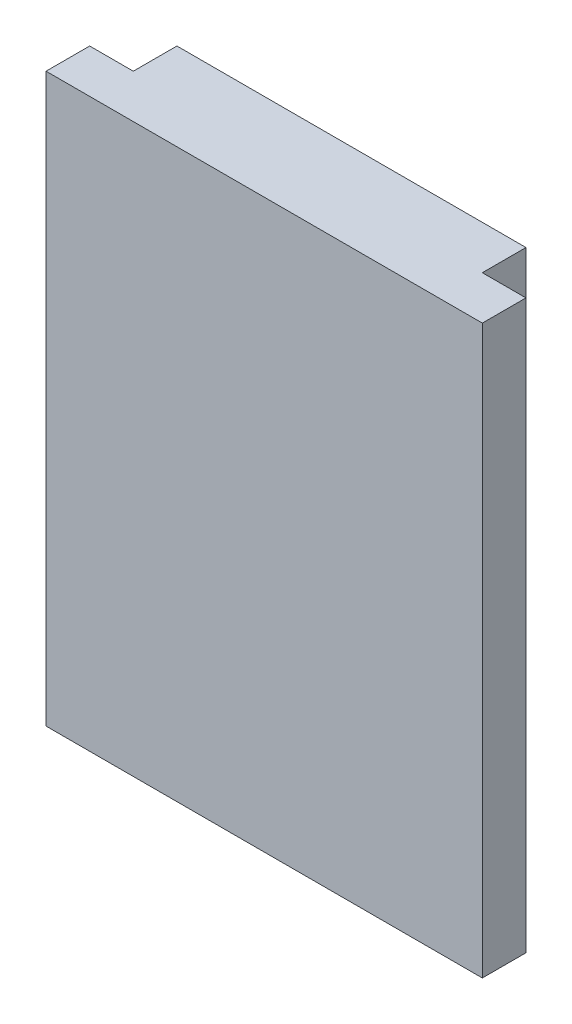
ISO-10303-21;
HEADER;
FILE_DESCRIPTION(('STEP AP214'),'2;1');
FILE_NAME('part.step','',(''),(''),'','','');
FILE_SCHEMA(('AUTOMOTIVE_DESIGN { 1 0 10303 214 1 1 1 1 }'));
ENDSEC;
DATA;
#1=APPLICATION_CONTEXT('core data for automotive mechanical design processes');
#2=APPLICATION_PROTOCOL_DEFINITION('international standard','automotive_design',2000,#1);
#3=PRODUCT_CONTEXT('',#1,'mechanical');
#4=PRODUCT('Part','Part','',(#3));
#5=PRODUCT_RELATED_PRODUCT_CATEGORY('part','',(#4));
#6=PRODUCT_DEFINITION_FORMATION('','',#4);
#7=PRODUCT_DEFINITION_CONTEXT('part definition',#1,'design');
#8=PRODUCT_DEFINITION('design','',#6,#7);
#9=PRODUCT_DEFINITION_SHAPE('','',#8);
#10=(LENGTH_UNIT() NAMED_UNIT(*) SI_UNIT(.MILLI.,.METRE.));
#11=(NAMED_UNIT(*) PLANE_ANGLE_UNIT() SI_UNIT($,.RADIAN.));
#12=(NAMED_UNIT(*) SI_UNIT($,.STERADIAN.) SOLID_ANGLE_UNIT());
#13=UNCERTAINTY_MEASURE_WITH_UNIT(LENGTH_MEASURE(1.E-05),#10,'distance_accuracy_value','');
#14=(GEOMETRIC_REPRESENTATION_CONTEXT(3) GLOBAL_UNCERTAINTY_ASSIGNED_CONTEXT((#13)) GLOBAL_UNIT_ASSIGNED_CONTEXT((#10,
#11,#12)) REPRESENTATION_CONTEXT('',''));
#15=CARTESIAN_POINT('',(0.,0.,0.));
#16=DIRECTION('',(0.,0.,1.));
#17=DIRECTION('',(1.,0.,0.));
#18=AXIS2_PLACEMENT_3D('',#15,#16,#17);
#19=CARTESIAN_POINT('',(0.,0.,5.));
#20=DIRECTION('',(1.,0.,0.));
#21=DIRECTION('',(0.,0.,-1.));
#22=AXIS2_PLACEMENT_3D('',#19,#20,#21);
#23=PLANE('',#22);
#24=DIRECTION('',(0.,-1.,0.));
#25=VECTOR('',#24,1.);
#26=CARTESIAN_POINT('',(0.,0.,0.));
#27=LINE('',#26,#25);
#28=CARTESIAN_POINT('',(0.,65.,0.));
#29=VERTEX_POINT('',#28);
#30=CARTESIAN_POINT('',(0.,0.,0.));
#31=VERTEX_POINT('',#30);
#32=EDGE_CURVE('E128',#29,#31,#27,.T.);
#33=ORIENTED_EDGE('',*,*,#32,.T.);
#34=DIRECTION('',(0.,0.,-1.));
#35=VECTOR('',#34,1.);
#36=CARTESIAN_POINT('',(0.,0.,5.));
#37=LINE('',#36,#35);
#38=CARTESIAN_POINT('',(0.,0.,5.));
#39=VERTEX_POINT('',#38);
#40=EDGE_CURVE('E11',#39,#31,#37,.T.);
#41=ORIENTED_EDGE('',*,*,#40,.F.);
#42=DIRECTION('',(0.,-1.,0.));
#43=VECTOR('',#42,1.);
#44=CARTESIAN_POINT('',(0.,0.,5.));
#45=LINE('',#44,#43);
#46=CARTESIAN_POINT('',(0.,65.,5.));
#47=VERTEX_POINT('',#46);
#48=EDGE_CURVE('E136',#47,#39,#45,.T.);
#49=ORIENTED_EDGE('',*,*,#48,.F.);
#50=DIRECTION('',(0.,0.,-1.));
#51=VECTOR('',#50,1.);
#52=CARTESIAN_POINT('',(0.,65.,5.));
#53=LINE('',#52,#51);
#54=EDGE_CURVE('E49',#47,#29,#53,.T.);
#55=ORIENTED_EDGE('',*,*,#54,.T.);
#56=EDGE_LOOP('',(#33,#41,#49,#55));
#57=FACE_BOUND('',#56,.T.);
#58=ADVANCED_FACE('F33',(#57),#23,.F.);
#59=CARTESIAN_POINT('',(0.,0.,5.));
#60=DIRECTION('',(0.,1.,0.));
#61=DIRECTION('',(0.,0.,1.));
#62=AXIS2_PLACEMENT_3D('',#59,#60,#61);
#63=PLANE('',#62);
#64=DIRECTION('',(1.,0.,0.));
#65=VECTOR('',#64,1.);
#66=CARTESIAN_POINT('',(0.,0.,0.));
#67=LINE('',#66,#65);
#68=CARTESIAN_POINT('',(40.,0.,0.));
#69=VERTEX_POINT('',#68);
#70=EDGE_CURVE('E130',#31,#69,#67,.T.);
#71=ORIENTED_EDGE('',*,*,#70,.T.);
#72=DIRECTION('',(0.,0.,-1.));
#73=VECTOR('',#72,1.);
#74=CARTESIAN_POINT('',(40.,0.,5.));
#75=LINE('',#74,#73);
#76=CARTESIAN_POINT('',(40.,0.,5.));
#77=VERTEX_POINT('',#76);
#78=EDGE_CURVE('E41',#77,#69,#75,.T.);
#79=ORIENTED_EDGE('',*,*,#78,.F.);
#80=DIRECTION('',(1.,0.,0.));
#81=VECTOR('',#80,1.);
#82=CARTESIAN_POINT('',(-5.,0.,5.));
#83=LINE('',#82,#81);
#84=CARTESIAN_POINT('',(45.,0.,5.));
#85=VERTEX_POINT('',#84);
#86=EDGE_CURVE('E167',#77,#85,#83,.T.);
#87=ORIENTED_EDGE('',*,*,#86,.T.);
#88=DIRECTION('',(0.,0.,-1.));
#89=VECTOR('',#88,1.);
#90=CARTESIAN_POINT('',(45.,0.,10.));
#91=LINE('',#90,#89);
#92=CARTESIAN_POINT('',(45.,0.,10.));
#93=VERTEX_POINT('',#92);
#94=EDGE_CURVE('E169',#93,#85,#91,.T.);
#95=ORIENTED_EDGE('',*,*,#94,.F.);
#96=DIRECTION('',(1.,0.,0.));
#97=VECTOR('',#96,1.);
#98=CARTESIAN_POINT('',(-5.,0.,10.));
#99=LINE('',#98,#97);
#100=CARTESIAN_POINT('',(-5.,0.,10.));
#101=VERTEX_POINT('',#100);
#102=EDGE_CURVE('E119',#101,#93,#99,.T.);
#103=ORIENTED_EDGE('',*,*,#102,.F.);
#104=DIRECTION('',(0.,0.,-1.));
#105=VECTOR('',#104,1.);
#106=CARTESIAN_POINT('',(-5.,0.,10.));
#107=LINE('',#106,#105);
#108=CARTESIAN_POINT('',(-5.,0.,5.));
#109=VERTEX_POINT('',#108);
#110=EDGE_CURVE('E132',#101,#109,#107,.T.);
#111=ORIENTED_EDGE('',*,*,#110,.T.);
#112=EDGE_CURVE('E123',#109,#39,#83,.T.);
#113=ORIENTED_EDGE('',*,*,#112,.T.);
#114=ORIENTED_EDGE('',*,*,#40,.T.);
#115=EDGE_LOOP('',(#71,#79,#87,#95,#103,#111,#113,#114));
#116=FACE_BOUND('',#115,.T.);
#117=ADVANCED_FACE('F172',(#116),#63,.F.);
#118=CARTESIAN_POINT('',(40.,0.,5.));
#119=DIRECTION('',(-1.,0.,0.));
#120=DIRECTION('',(0.,0.,1.));
#121=AXIS2_PLACEMENT_3D('',#118,#119,#120);
#122=PLANE('',#121);
#123=DIRECTION('',(0.,1.,0.));
#124=VECTOR('',#123,1.);
#125=CARTESIAN_POINT('',(40.,0.,0.));
#126=LINE('',#125,#124);
#127=CARTESIAN_POINT('',(40.,65.,0.));
#128=VERTEX_POINT('',#127);
#129=EDGE_CURVE('E68',#69,#128,#126,.T.);
#130=ORIENTED_EDGE('',*,*,#129,.T.);
#131=DIRECTION('',(0.,0.,-1.));
#132=VECTOR('',#131,1.);
#133=CARTESIAN_POINT('',(40.,65.,5.));
#134=LINE('',#133,#132);
#135=CARTESIAN_POINT('',(40.,65.,5.));
#136=VERTEX_POINT('',#135);
#137=EDGE_CURVE('E145',#136,#128,#134,.T.);
#138=ORIENTED_EDGE('',*,*,#137,.F.);
#139=DIRECTION('',(0.,1.,0.));
#140=VECTOR('',#139,1.);
#141=CARTESIAN_POINT('',(40.,0.,5.));
#142=LINE('',#141,#140);
#143=EDGE_CURVE('E138',#77,#136,#142,.T.);
#144=ORIENTED_EDGE('',*,*,#143,.F.);
#145=ORIENTED_EDGE('',*,*,#78,.T.);
#146=EDGE_LOOP('',(#130,#138,#144,#145));
#147=FACE_BOUND('',#146,.T.);
#148=ADVANCED_FACE('F147',(#147),#122,.F.);
#149=CARTESIAN_POINT('',(0.,65.,5.));
#150=DIRECTION('',(0.,-1.,0.));
#151=DIRECTION('',(0.,0.,-1.));
#152=AXIS2_PLACEMENT_3D('',#149,#150,#151);
#153=PLANE('',#152);
#154=DIRECTION('',(-1.,0.,0.));
#155=VECTOR('',#154,1.);
#156=CARTESIAN_POINT('',(0.,65.,0.));
#157=LINE('',#156,#155);
#158=EDGE_CURVE('E71',#128,#29,#157,.T.);
#159=ORIENTED_EDGE('',*,*,#158,.T.);
#160=ORIENTED_EDGE('',*,*,#54,.F.);
#161=DIRECTION('',(-1.,0.,0.));
#162=VECTOR('',#161,1.);
#163=CARTESIAN_POINT('',(-5.,65.,5.));
#164=LINE('',#163,#162);
#165=CARTESIAN_POINT('',(-5.,65.,5.));
#166=VERTEX_POINT('',#165);
#167=EDGE_CURVE('E158',#47,#166,#164,.T.);
#168=ORIENTED_EDGE('',*,*,#167,.T.);
#169=DIRECTION('',(0.,0.,-1.));
#170=VECTOR('',#169,1.);
#171=CARTESIAN_POINT('',(-5.,65.,10.));
#172=LINE('',#171,#170);
#173=CARTESIAN_POINT('',(-5.,65.,10.));
#174=VERTEX_POINT('',#173);
#175=EDGE_CURVE('E110',#174,#166,#172,.T.);
#176=ORIENTED_EDGE('',*,*,#175,.F.);
#177=DIRECTION('',(-1.,0.,0.));
#178=VECTOR('',#177,1.);
#179=CARTESIAN_POINT('',(-5.,65.,10.));
#180=LINE('',#179,#178);
#181=CARTESIAN_POINT('',(45.,65.,10.));
#182=VERTEX_POINT('',#181);
#183=EDGE_CURVE('E102',#182,#174,#180,.T.);
#184=ORIENTED_EDGE('',*,*,#183,.F.);
#185=DIRECTION('',(0.,0.,-1.));
#186=VECTOR('',#185,1.);
#187=CARTESIAN_POINT('',(45.,65.,10.));
#188=LINE('',#187,#186);
#189=CARTESIAN_POINT('',(45.,65.,5.));
#190=VERTEX_POINT('',#189);
#191=EDGE_CURVE('E107',#182,#190,#188,.T.);
#192=ORIENTED_EDGE('',*,*,#191,.T.);
#193=EDGE_CURVE('E161',#190,#136,#164,.T.);
#194=ORIENTED_EDGE('',*,*,#193,.T.);
#195=ORIENTED_EDGE('',*,*,#137,.T.);
#196=EDGE_LOOP('',(#159,#160,#168,#176,#184,#192,#194,#195));
#197=FACE_BOUND('',#196,.T.);
#198=ADVANCED_FACE('F104',(#197),#153,.F.);
#199=CARTESIAN_POINT('',(0.,0.,0.));
#200=DIRECTION('',(0.,0.,-1.));
#201=DIRECTION('',(-1.,0.,0.));
#202=AXIS2_PLACEMENT_3D('',#199,#200,#201);
#203=PLANE('',#202);
#204=ORIENTED_EDGE('',*,*,#32,.F.);
#205=ORIENTED_EDGE('',*,*,#158,.F.);
#206=ORIENTED_EDGE('',*,*,#129,.F.);
#207=ORIENTED_EDGE('',*,*,#70,.F.);
#208=EDGE_LOOP('',(#204,#205,#206,#207));
#209=FACE_BOUND('',#208,.T.);
#210=ADVANCED_FACE('F152',(#209),#203,.T.);
#211=CARTESIAN_POINT('',(0.,0.,5.));
#212=DIRECTION('',(0.,0.,1.));
#213=DIRECTION('',(1.,0.,0.));
#214=AXIS2_PLACEMENT_3D('',#211,#212,#213);
#215=PLANE('',#214);
#216=ORIENTED_EDGE('',*,*,#167,.F.);
#217=ORIENTED_EDGE('',*,*,#48,.T.);
#218=ORIENTED_EDGE('',*,*,#112,.F.);
#219=DIRECTION('',(0.,-1.,0.));
#220=VECTOR('',#219,1.);
#221=CARTESIAN_POINT('',(-5.,65.,5.));
#222=LINE('',#221,#220);
#223=EDGE_CURVE('E160',#166,#109,#222,.T.);
#224=ORIENTED_EDGE('',*,*,#223,.F.);
#225=EDGE_LOOP('',(#216,#217,#218,#224));
#226=FACE_BOUND('',#225,.T.);
#227=ADVANCED_FACE('F159',(#226),#215,.F.);
#228=ORIENTED_EDGE('',*,*,#86,.F.);
#229=ORIENTED_EDGE('',*,*,#143,.T.);
#230=ORIENTED_EDGE('',*,*,#193,.F.);
#231=DIRECTION('',(0.,1.,0.));
#232=VECTOR('',#231,1.);
#233=CARTESIAN_POINT('',(45.,65.,5.));
#234=LINE('',#233,#232);
#235=EDGE_CURVE('E127',#85,#190,#234,.T.);
#236=ORIENTED_EDGE('',*,*,#235,.F.);
#237=EDGE_LOOP('',(#228,#229,#230,#236));
#238=FACE_BOUND('',#237,.T.);
#239=ADVANCED_FACE('F183',(#238),#215,.F.);
#240=CARTESIAN_POINT('',(45.,65.,10.));
#241=DIRECTION('',(-1.,0.,0.));
#242=DIRECTION('',(0.,0.,1.));
#243=AXIS2_PLACEMENT_3D('',#240,#241,#242);
#244=PLANE('',#243);
#245=ORIENTED_EDGE('',*,*,#235,.T.);
#246=ORIENTED_EDGE('',*,*,#191,.F.);
#247=DIRECTION('',(0.,1.,0.));
#248=VECTOR('',#247,1.);
#249=CARTESIAN_POINT('',(45.,65.,10.));
#250=LINE('',#249,#248);
#251=EDGE_CURVE('E114',#93,#182,#250,.T.);
#252=ORIENTED_EDGE('',*,*,#251,.F.);
#253=ORIENTED_EDGE('',*,*,#94,.T.);
#254=EDGE_LOOP('',(#245,#246,#252,#253));
#255=FACE_BOUND('',#254,.T.);
#256=ADVANCED_FACE('F125',(#255),#244,.F.);
#257=CARTESIAN_POINT('',(-5.,65.,10.));
#258=DIRECTION('',(1.,0.,0.));
#259=DIRECTION('',(0.,0.,-1.));
#260=AXIS2_PLACEMENT_3D('',#257,#258,#259);
#261=PLANE('',#260);
#262=ORIENTED_EDGE('',*,*,#223,.T.);
#263=ORIENTED_EDGE('',*,*,#110,.F.);
#264=DIRECTION('',(0.,-1.,0.));
#265=VECTOR('',#264,1.);
#266=CARTESIAN_POINT('',(-5.,65.,10.));
#267=LINE('',#266,#265);
#268=EDGE_CURVE('E113',#174,#101,#267,.T.);
#269=ORIENTED_EDGE('',*,*,#268,.F.);
#270=ORIENTED_EDGE('',*,*,#175,.T.);
#271=EDGE_LOOP('',(#262,#263,#269,#270));
#272=FACE_BOUND('',#271,.T.);
#273=ADVANCED_FACE('F174',(#272),#261,.F.);
#274=CARTESIAN_POINT('',(0.,0.,10.));
#275=DIRECTION('',(0.,0.,1.));
#276=DIRECTION('',(1.,0.,0.));
#277=AXIS2_PLACEMENT_3D('',#274,#275,#276);
#278=PLANE('',#277);
#279=ORIENTED_EDGE('',*,*,#251,.T.);
#280=ORIENTED_EDGE('',*,*,#183,.T.);
#281=ORIENTED_EDGE('',*,*,#268,.T.);
#282=ORIENTED_EDGE('',*,*,#102,.T.);
#283=EDGE_LOOP('',(#279,#280,#281,#282));
#284=FACE_BOUND('',#283,.T.);
#285=ADVANCED_FACE('F117',(#284),#278,.T.);
#286=CLOSED_SHELL('',(#58,#117,#148,#198,#210,#227,#239,#256,#273,#285));
#287=MANIFOLD_SOLID_BREP('B2',#286);
#288=ADVANCED_BREP_SHAPE_REPRESENTATION('',(#18,#287),#14);
#289=SHAPE_DEFINITION_REPRESENTATION(#9,#288);
ENDSEC;
END-ISO-10303-21;
